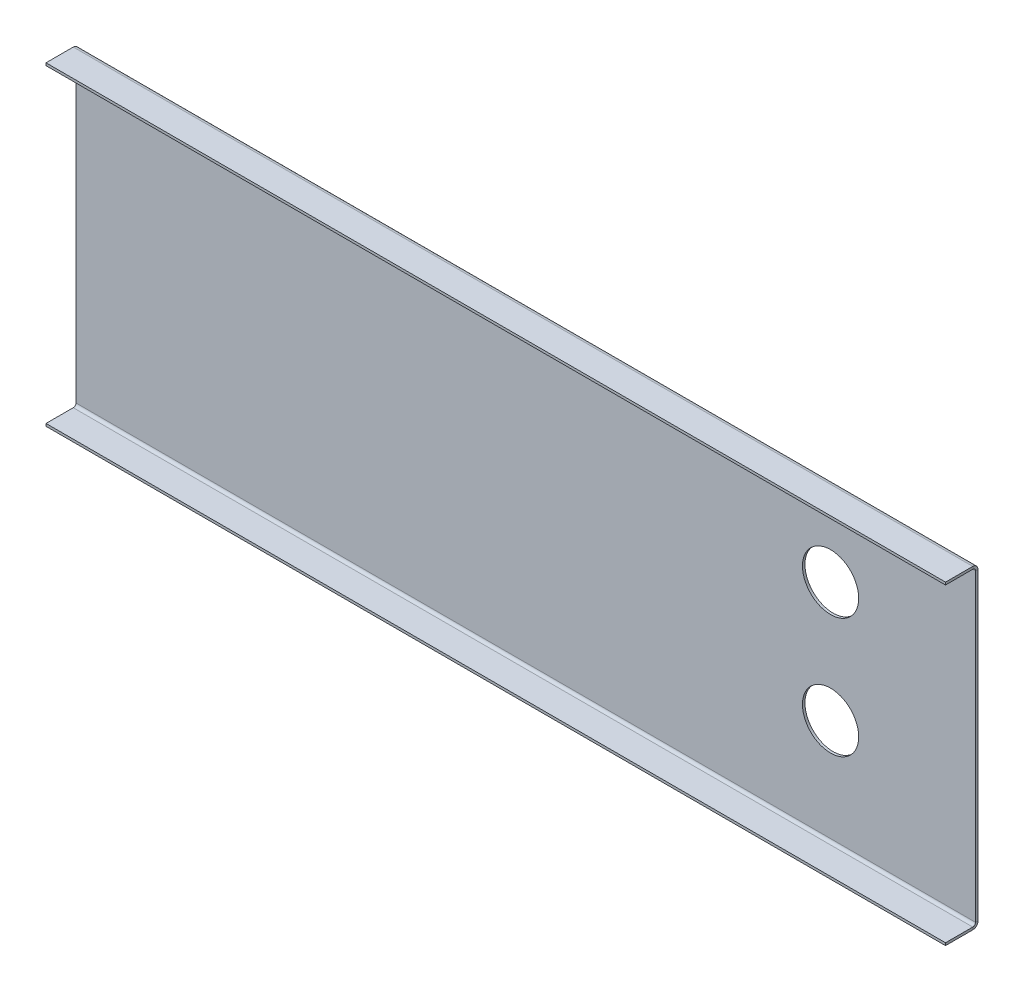
ISO-10303-21;
HEADER;
FILE_DESCRIPTION(('STEP AP214'),'2;1');
FILE_NAME('part.step','',(''),(''),'','','');
FILE_SCHEMA(('AUTOMOTIVE_DESIGN { 1 0 10303 214 1 1 1 1 }'));
ENDSEC;
DATA;
#1=APPLICATION_CONTEXT('core data for automotive mechanical design processes');
#2=APPLICATION_PROTOCOL_DEFINITION('international standard','automotive_design',2000,#1);
#3=PRODUCT_CONTEXT('',#1,'mechanical');
#4=PRODUCT('Part','Part','',(#3));
#5=PRODUCT_RELATED_PRODUCT_CATEGORY('part','',(#4));
#6=PRODUCT_DEFINITION_FORMATION('','',#4);
#7=PRODUCT_DEFINITION_CONTEXT('part definition',#1,'design');
#8=PRODUCT_DEFINITION('design','',#6,#7);
#9=PRODUCT_DEFINITION_SHAPE('','',#8);
#10=(LENGTH_UNIT() NAMED_UNIT(*) SI_UNIT(.MILLI.,.METRE.));
#11=(NAMED_UNIT(*) PLANE_ANGLE_UNIT() SI_UNIT($,.RADIAN.));
#12=(NAMED_UNIT(*) SI_UNIT($,.STERADIAN.) SOLID_ANGLE_UNIT());
#13=UNCERTAINTY_MEASURE_WITH_UNIT(LENGTH_MEASURE(1.E-05),#10,'distance_accuracy_value','');
#14=(GEOMETRIC_REPRESENTATION_CONTEXT(3) GLOBAL_UNCERTAINTY_ASSIGNED_CONTEXT((#13)) GLOBAL_UNIT_ASSIGNED_CONTEXT((#10,
#11,#12)) REPRESENTATION_CONTEXT('',''));
#15=CARTESIAN_POINT('',(0.,0.,0.));
#16=DIRECTION('',(0.,0.,1.));
#17=DIRECTION('',(1.,0.,0.));
#18=AXIS2_PLACEMENT_3D('',#15,#16,#17);
#19=CARTESIAN_POINT('',(0.,0.,-1.));
#20=DIRECTION('',(0.,0.,1.));
#21=DIRECTION('',(1.,0.,0.));
#22=AXIS2_PLACEMENT_3D('',#19,#20,#21);
#23=PLANE('',#22);
#24=CARTESIAN_POINT('',(244.300049420994,-56.452668213457,-1.));
#25=DIRECTION('',(0.,0.,-1.));
#26=DIRECTION('',(-1.,0.,0.));
#27=AXIS2_PLACEMENT_3D('',#24,#25,#26);
#28=CIRCLE('',#27,11.25);
#29=CARTESIAN_POINT('',(233.050049420994,-56.452668213457,-1.));
#30=VERTEX_POINT('',#29);
#31=EDGE_CURVE('E260',#30,#30,#28,.T.);
#32=ORIENTED_EDGE('',*,*,#31,.F.);
#33=EDGE_LOOP('',(#32));
#34=FACE_BOUND('',#33,.T.);
#35=CARTESIAN_POINT('',(244.300049420994,-8.45266821345704,-1.));
#36=DIRECTION('',(0.,0.,-1.));
#37=DIRECTION('',(-1.,0.,0.));
#38=AXIS2_PLACEMENT_3D('',#35,#36,#37);
#39=CIRCLE('',#38,11.25);
#40=CARTESIAN_POINT('',(233.050049420994,-8.45266821345704,-1.));
#41=VERTEX_POINT('',#40);
#42=EDGE_CURVE('E251',#41,#41,#39,.T.);
#43=ORIENTED_EDGE('',*,*,#42,.F.);
#44=EDGE_LOOP('',(#43));
#45=FACE_BOUND('',#44,.T.);
#46=DIRECTION('',(1.,0.,0.));
#47=VECTOR('',#46,1.);
#48=CARTESIAN_POINT('',(302.300049420994,-97.3526682134571,-1.));
#49=LINE('',#48,#47);
#50=CARTESIAN_POINT('',(302.300049420994,-97.3526682134571,-1.));
#51=VERTEX_POINT('',#50);
#52=CARTESIAN_POINT('',(-57.699950579006,-97.3526682134571,-1.));
#53=VERTEX_POINT('',#52);
#54=EDGE_CURVE('E133',#51,#53,#49,.F.);
#55=ORIENTED_EDGE('',*,*,#54,.T.);
#56=DIRECTION('',(0.,-1.,0.));
#57=VECTOR('',#56,1.);
#58=CARTESIAN_POINT('',(-57.699950579006,25.5473317865429,-1.));
#59=LINE('',#58,#57);
#60=CARTESIAN_POINT('',(-57.699950579006,24.4473317865429,-1.));
#61=VERTEX_POINT('',#60);
#62=EDGE_CURVE('E44',#61,#53,#59,.T.);
#63=ORIENTED_EDGE('',*,*,#62,.F.);
#64=DIRECTION('',(-1.,0.,0.));
#65=VECTOR('',#64,1.);
#66=CARTESIAN_POINT('',(-57.699950579006,24.4473317865429,-1.));
#67=LINE('',#66,#65);
#68=CARTESIAN_POINT('',(302.300049420994,24.4473317865429,-1.));
#69=VERTEX_POINT('',#68);
#70=EDGE_CURVE('E223',#61,#69,#67,.F.);
#71=ORIENTED_EDGE('',*,*,#70,.T.);
#72=DIRECTION('',(0.,1.,0.));
#73=VECTOR('',#72,1.);
#74=CARTESIAN_POINT('',(302.300049420994,25.5473317865429,-1.));
#75=LINE('',#74,#73);
#76=EDGE_CURVE('E11',#51,#69,#75,.T.);
#77=ORIENTED_EDGE('',*,*,#76,.F.);
#78=EDGE_LOOP('',(#55,#63,#71,#77));
#79=FACE_BOUND('',#78,.T.);
#80=ADVANCED_FACE('F35',(#34,#45,#79),#23,.F.);
#81=CARTESIAN_POINT('',(0.,0.,0.));
#82=DIRECTION('',(0.,0.,1.));
#83=DIRECTION('',(1.,0.,0.));
#84=AXIS2_PLACEMENT_3D('',#81,#82,#83);
#85=PLANE('',#84);
#86=CARTESIAN_POINT('',(244.300049420994,-56.452668213457,0.));
#87=DIRECTION('',(0.,0.,1.));
#88=DIRECTION('',(1.,0.,0.));
#89=AXIS2_PLACEMENT_3D('',#86,#87,#88);
#90=CIRCLE('',#89,11.25);
#91=CARTESIAN_POINT('',(255.550049420994,-56.452668213457,0.));
#92=VERTEX_POINT('',#91);
#93=EDGE_CURVE('E39',#92,#92,#90,.T.);
#94=ORIENTED_EDGE('',*,*,#93,.F.);
#95=EDGE_LOOP('',(#94));
#96=FACE_BOUND('',#95,.T.);
#97=CARTESIAN_POINT('',(244.300049420994,-8.45266821345704,0.));
#98=DIRECTION('',(0.,0.,1.));
#99=DIRECTION('',(1.,0.,0.));
#100=AXIS2_PLACEMENT_3D('',#97,#98,#99);
#101=CIRCLE('',#100,11.25);
#102=CARTESIAN_POINT('',(255.550049420994,-8.45266821345704,0.));
#103=VERTEX_POINT('',#102);
#104=EDGE_CURVE('E248',#103,#103,#101,.T.);
#105=ORIENTED_EDGE('',*,*,#104,.F.);
#106=EDGE_LOOP('',(#105));
#107=FACE_BOUND('',#106,.T.);
#108=DIRECTION('',(0.,-1.,0.));
#109=VECTOR('',#108,1.);
#110=CARTESIAN_POINT('',(-57.699950579006,25.5473317865429,0.));
#111=LINE('',#110,#109);
#112=CARTESIAN_POINT('',(-57.699950579006,24.4473317865429,0.));
#113=VERTEX_POINT('',#112);
#114=CARTESIAN_POINT('',(-57.699950579006,-97.3526682134571,0.));
#115=VERTEX_POINT('',#114);
#116=EDGE_CURVE('E241',#113,#115,#111,.T.);
#117=ORIENTED_EDGE('',*,*,#116,.T.);
#118=DIRECTION('',(1.,0.,0.));
#119=VECTOR('',#118,1.);
#120=CARTESIAN_POINT('',(302.300049420994,-97.3526682134571,0.));
#121=LINE('',#120,#119);
#122=CARTESIAN_POINT('',(302.300049420994,-97.3526682134571,0.));
#123=VERTEX_POINT('',#122);
#124=EDGE_CURVE('E184',#123,#115,#121,.F.);
#125=ORIENTED_EDGE('',*,*,#124,.F.);
#126=DIRECTION('',(0.,1.,0.));
#127=VECTOR('',#126,1.);
#128=CARTESIAN_POINT('',(302.300049420994,25.5473317865429,0.));
#129=LINE('',#128,#127);
#130=CARTESIAN_POINT('',(302.300049420994,24.4473317865429,0.));
#131=VERTEX_POINT('',#130);
#132=EDGE_CURVE('E245',#123,#131,#129,.T.);
#133=ORIENTED_EDGE('',*,*,#132,.T.);
#134=DIRECTION('',(-1.,0.,0.));
#135=VECTOR('',#134,1.);
#136=CARTESIAN_POINT('',(-57.699950579006,24.4473317865429,0.));
#137=LINE('',#136,#135);
#138=EDGE_CURVE('E52',#113,#131,#137,.F.);
#139=ORIENTED_EDGE('',*,*,#138,.F.);
#140=EDGE_LOOP('',(#117,#125,#133,#139));
#141=FACE_BOUND('',#140,.T.);
#142=ADVANCED_FACE('F289',(#96,#107,#141),#85,.T.);
#143=CARTESIAN_POINT('',(302.300049420994,25.5473317865429,-1.));
#144=DIRECTION('',(1.,0.,0.));
#145=DIRECTION('',(0.,0.,-1.));
#146=AXIS2_PLACEMENT_3D('',#143,#144,#145);
#147=PLANE('',#146);
#148=ORIENTED_EDGE('',*,*,#132,.F.);
#149=DIRECTION('',(0.,0.,-1.));
#150=VECTOR('',#149,1.);
#151=CARTESIAN_POINT('',(302.300049420994,-97.3526682134571,0.));
#152=LINE('',#151,#150);
#153=EDGE_CURVE('E180',#123,#51,#152,.T.);
#154=ORIENTED_EDGE('',*,*,#153,.T.);
#155=ORIENTED_EDGE('',*,*,#76,.T.);
#156=DIRECTION('',(0.,0.,-1.));
#157=VECTOR('',#156,1.);
#158=CARTESIAN_POINT('',(302.300049420994,24.4473317865429,0.));
#159=LINE('',#158,#157);
#160=EDGE_CURVE('E238',#131,#69,#159,.T.);
#161=ORIENTED_EDGE('',*,*,#160,.F.);
#162=EDGE_LOOP('',(#148,#154,#155,#161));
#163=FACE_BOUND('',#162,.T.);
#164=ADVANCED_FACE('F295',(#163),#147,.T.);
#165=CARTESIAN_POINT('',(-57.699950579006,25.5473317865429,-1.));
#166=DIRECTION('',(-1.,0.,0.));
#167=DIRECTION('',(0.,-1.,0.));
#168=AXIS2_PLACEMENT_3D('',#165,#166,#167);
#169=PLANE('',#168);
#170=DIRECTION('',(0.,0.,-1.));
#171=VECTOR('',#170,1.);
#172=CARTESIAN_POINT('',(-57.699950579006,-97.3526682134571,0.));
#173=LINE('',#172,#171);
#174=EDGE_CURVE('E188',#115,#53,#173,.T.);
#175=ORIENTED_EDGE('',*,*,#174,.F.);
#176=ORIENTED_EDGE('',*,*,#116,.F.);
#177=DIRECTION('',(0.,0.,-1.));
#178=VECTOR('',#177,1.);
#179=CARTESIAN_POINT('',(-57.699950579006,24.4473317865429,0.));
#180=LINE('',#179,#178);
#181=EDGE_CURVE('E229',#113,#61,#180,.T.);
#182=ORIENTED_EDGE('',*,*,#181,.T.);
#183=ORIENTED_EDGE('',*,*,#62,.T.);
#184=EDGE_LOOP('',(#175,#176,#182,#183));
#185=FACE_BOUND('',#184,.T.);
#186=ADVANCED_FACE('F37',(#185),#169,.T.);
#187=CARTESIAN_POINT('',(302.300049420994,24.4473317865429,1.1));
#188=DIRECTION('',(1.,0.,0.));
#189=DIRECTION('',(0.,0.,-1.));
#190=AXIS2_PLACEMENT_3D('',#187,#188,#189);
#191=PLANE('',#190);
#192=DIRECTION('',(0.,1.,0.));
#193=VECTOR('',#192,1.);
#194=CARTESIAN_POINT('',(302.300049420994,25.5473317865429,1.1));
#195=LINE('',#194,#193);
#196=CARTESIAN_POINT('',(302.300049420994,25.5473317865429,1.09999999999999));
#197=VERTEX_POINT('',#196);
#198=CARTESIAN_POINT('',(302.300049420994,26.5473317865429,1.09999999999999));
#199=VERTEX_POINT('',#198);
#200=EDGE_CURVE('E191',#197,#199,#195,.T.);
#201=ORIENTED_EDGE('',*,*,#200,.F.);
#202=CARTESIAN_POINT('',(302.300049420994,24.4473317865429,1.1));
#203=DIRECTION('',(-1.,0.,0.));
#204=DIRECTION('',(0.,0.,1.));
#205=AXIS2_PLACEMENT_3D('',#202,#203,#204);
#206=CIRCLE('',#205,1.1);
#207=EDGE_CURVE('E232',#131,#197,#206,.F.);
#208=ORIENTED_EDGE('',*,*,#207,.F.);
#209=ORIENTED_EDGE('',*,*,#160,.T.);
#210=CARTESIAN_POINT('',(302.300049420994,24.4473317865429,1.1));
#211=DIRECTION('',(-1.,0.,0.));
#212=DIRECTION('',(0.,0.,1.));
#213=AXIS2_PLACEMENT_3D('',#210,#211,#212);
#214=CIRCLE('',#213,2.1);
#215=EDGE_CURVE('E225',#69,#199,#214,.F.);
#216=ORIENTED_EDGE('',*,*,#215,.T.);
#217=EDGE_LOOP('',(#201,#208,#209,#216));
#218=FACE_BOUND('',#217,.T.);
#219=ADVANCED_FACE('F308',(#218),#191,.T.);
#220=CARTESIAN_POINT('',(-57.699950579006,24.4473317865429,1.1));
#221=DIRECTION('',(1.,0.,0.));
#222=DIRECTION('',(0.,0.,-1.));
#223=AXIS2_PLACEMENT_3D('',#220,#221,#222);
#224=PLANE('',#223);
#225=CARTESIAN_POINT('',(-57.699950579006,24.4473317865429,1.1));
#226=DIRECTION('',(-1.,0.,0.));
#227=DIRECTION('',(0.,0.,1.));
#228=AXIS2_PLACEMENT_3D('',#225,#226,#227);
#229=CIRCLE('',#228,1.1);
#230=CARTESIAN_POINT('',(-57.699950579006,25.5473317865429,1.09999999999999));
#231=VERTEX_POINT('',#230);
#232=EDGE_CURVE('E222',#231,#113,#229,.T.);
#233=ORIENTED_EDGE('',*,*,#232,.F.);
#234=DIRECTION('',(0.,1.,0.));
#235=VECTOR('',#234,1.);
#236=CARTESIAN_POINT('',(-57.699950579006,25.5473317865429,1.09999999999999));
#237=LINE('',#236,#235);
#238=CARTESIAN_POINT('',(-57.699950579006,26.5473317865429,1.09999999999999));
#239=VERTEX_POINT('',#238);
#240=EDGE_CURVE('E195',#231,#239,#237,.T.);
#241=ORIENTED_EDGE('',*,*,#240,.T.);
#242=CARTESIAN_POINT('',(-57.699950579006,24.4473317865429,1.1));
#243=DIRECTION('',(-1.,0.,0.));
#244=DIRECTION('',(0.,0.,1.));
#245=AXIS2_PLACEMENT_3D('',#242,#243,#244);
#246=CIRCLE('',#245,2.1);
#247=EDGE_CURVE('E226',#239,#61,#246,.T.);
#248=ORIENTED_EDGE('',*,*,#247,.T.);
#249=ORIENTED_EDGE('',*,*,#181,.F.);
#250=EDGE_LOOP('',(#233,#241,#248,#249));
#251=FACE_BOUND('',#250,.T.);
#252=ADVANCED_FACE('F301',(#251),#224,.F.);
#253=CARTESIAN_POINT('',(-57.699950579006,24.4473317865429,1.1));
#254=DIRECTION('',(-1.,0.,0.));
#255=DIRECTION('',(0.,1.,0.));
#256=AXIS2_PLACEMENT_3D('',#253,#254,#255);
#257=CYLINDRICAL_SURFACE('',#256,2.1);
#258=ORIENTED_EDGE('',*,*,#70,.F.);
#259=ORIENTED_EDGE('',*,*,#247,.F.);
#260=DIRECTION('',(1.,0.,0.));
#261=VECTOR('',#260,1.);
#262=CARTESIAN_POINT('',(0.,26.5473317865429,1.09999999999999));
#263=LINE('',#262,#261);
#264=EDGE_CURVE('E198',#239,#199,#263,.T.);
#265=ORIENTED_EDGE('',*,*,#264,.T.);
#266=ORIENTED_EDGE('',*,*,#215,.F.);
#267=EDGE_LOOP('',(#258,#259,#265,#266));
#268=FACE_BOUND('',#267,.T.);
#269=ADVANCED_FACE('F320',(#268),#257,.T.);
#270=CARTESIAN_POINT('',(-57.699950579006,24.4473317865429,1.1));
#271=DIRECTION('',(-1.,0.,0.));
#272=DIRECTION('',(0.,1.,0.));
#273=AXIS2_PLACEMENT_3D('',#270,#271,#272);
#274=CYLINDRICAL_SURFACE('',#273,1.1);
#275=ORIENTED_EDGE('',*,*,#138,.T.);
#276=ORIENTED_EDGE('',*,*,#207,.T.);
#277=DIRECTION('',(-1.,0.,0.));
#278=VECTOR('',#277,1.);
#279=CARTESIAN_POINT('',(302.300049420994,25.5473317865429,1.1));
#280=LINE('',#279,#278);
#281=EDGE_CURVE('E193',#197,#231,#280,.T.);
#282=ORIENTED_EDGE('',*,*,#281,.T.);
#283=ORIENTED_EDGE('',*,*,#232,.T.);
#284=EDGE_LOOP('',(#275,#276,#282,#283));
#285=FACE_BOUND('',#284,.T.);
#286=ADVANCED_FACE('F341',(#285),#274,.F.);
#287=CARTESIAN_POINT('',(-57.6999505790059,26.547331786543,12.));
#288=DIRECTION('',(1.,0.,0.));
#289=DIRECTION('',(0.,0.,-1.));
#290=AXIS2_PLACEMENT_3D('',#287,#288,#289);
#291=PLANE('',#290);
#292=ORIENTED_EDGE('',*,*,#240,.F.);
#293=DIRECTION('',(0.,0.,1.));
#294=VECTOR('',#293,1.);
#295=CARTESIAN_POINT('',(-57.6999505790059,25.547331786543,12.));
#296=LINE('',#295,#294);
#297=CARTESIAN_POINT('',(-57.6999505790059,25.547331786543,12.));
#298=VERTEX_POINT('',#297);
#299=EDGE_CURVE('E202',#231,#298,#296,.T.);
#300=ORIENTED_EDGE('',*,*,#299,.T.);
#301=DIRECTION('',(0.,-1.,0.));
#302=VECTOR('',#301,1.);
#303=CARTESIAN_POINT('',(-57.6999505790059,26.547331786543,12.));
#304=LINE('',#303,#302);
#305=CARTESIAN_POINT('',(-57.6999505790059,26.547331786543,12.));
#306=VERTEX_POINT('',#305);
#307=EDGE_CURVE('E219',#306,#298,#304,.T.);
#308=ORIENTED_EDGE('',*,*,#307,.F.);
#309=DIRECTION('',(0.,0.,1.));
#310=VECTOR('',#309,1.);
#311=CARTESIAN_POINT('',(-57.6999505790059,26.547331786543,12.));
#312=LINE('',#311,#310);
#313=EDGE_CURVE('E203',#239,#306,#312,.T.);
#314=ORIENTED_EDGE('',*,*,#313,.F.);
#315=EDGE_LOOP('',(#292,#300,#308,#314));
#316=FACE_BOUND('',#315,.T.);
#317=ADVANCED_FACE('F329',(#316),#291,.F.);
#318=CARTESIAN_POINT('',(302.300049420994,26.5473317865429,0.));
#319=DIRECTION('',(-1.,0.,0.));
#320=DIRECTION('',(0.,0.,1.));
#321=AXIS2_PLACEMENT_3D('',#318,#319,#320);
#322=PLANE('',#321);
#323=ORIENTED_EDGE('',*,*,#200,.T.);
#324=DIRECTION('',(0.,0.,-1.));
#325=VECTOR('',#324,1.);
#326=CARTESIAN_POINT('',(302.300049420994,26.5473317865429,0.));
#327=LINE('',#326,#325);
#328=CARTESIAN_POINT('',(302.300049420994,26.547331786543,12.));
#329=VERTEX_POINT('',#328);
#330=EDGE_CURVE('E208',#329,#199,#327,.T.);
#331=ORIENTED_EDGE('',*,*,#330,.F.);
#332=DIRECTION('',(0.,-1.,0.));
#333=VECTOR('',#332,1.);
#334=CARTESIAN_POINT('',(302.300049420994,26.547331786543,12.));
#335=LINE('',#334,#333);
#336=CARTESIAN_POINT('',(302.300049420994,25.547331786543,12.));
#337=VERTEX_POINT('',#336);
#338=EDGE_CURVE('E211',#329,#337,#335,.T.);
#339=ORIENTED_EDGE('',*,*,#338,.T.);
#340=DIRECTION('',(0.,0.,-1.));
#341=VECTOR('',#340,1.);
#342=CARTESIAN_POINT('',(302.300049420994,25.5473317865429,0.));
#343=LINE('',#342,#341);
#344=EDGE_CURVE('E206',#337,#197,#343,.T.);
#345=ORIENTED_EDGE('',*,*,#344,.T.);
#346=EDGE_LOOP('',(#323,#331,#339,#345));
#347=FACE_BOUND('',#346,.T.);
#348=ADVANCED_FACE('F338',(#347),#322,.F.);
#349=CARTESIAN_POINT('',(0.,26.5473317865429,0.));
#350=DIRECTION('',(0.,-1.,0.));
#351=DIRECTION('',(0.,0.,-1.));
#352=AXIS2_PLACEMENT_3D('',#349,#350,#351);
#353=PLANE('',#352);
#354=ORIENTED_EDGE('',*,*,#264,.F.);
#355=ORIENTED_EDGE('',*,*,#313,.T.);
#356=DIRECTION('',(1.,0.,0.));
#357=VECTOR('',#356,1.);
#358=CARTESIAN_POINT('',(302.300049420994,26.547331786543,12.));
#359=LINE('',#358,#357);
#360=EDGE_CURVE('E205',#306,#329,#359,.T.);
#361=ORIENTED_EDGE('',*,*,#360,.T.);
#362=ORIENTED_EDGE('',*,*,#330,.T.);
#363=EDGE_LOOP('',(#354,#355,#361,#362));
#364=FACE_BOUND('',#363,.T.);
#365=ADVANCED_FACE('F324',(#364),#353,.F.);
#366=CARTESIAN_POINT('',(0.,25.5473317865429,0.));
#367=DIRECTION('',(0.,-1.,0.));
#368=DIRECTION('',(0.,0.,-1.));
#369=AXIS2_PLACEMENT_3D('',#366,#367,#368);
#370=PLANE('',#369);
#371=ORIENTED_EDGE('',*,*,#299,.F.);
#372=ORIENTED_EDGE('',*,*,#281,.F.);
#373=ORIENTED_EDGE('',*,*,#344,.F.);
#374=DIRECTION('',(1.,0.,0.));
#375=VECTOR('',#374,1.);
#376=CARTESIAN_POINT('',(302.300049420994,25.547331786543,12.));
#377=LINE('',#376,#375);
#378=EDGE_CURVE('E213',#298,#337,#377,.T.);
#379=ORIENTED_EDGE('',*,*,#378,.F.);
#380=EDGE_LOOP('',(#371,#372,#373,#379));
#381=FACE_BOUND('',#380,.T.);
#382=ADVANCED_FACE('F344',(#381),#370,.T.);
#383=CARTESIAN_POINT('',(302.300049420994,26.547331786543,12.));
#384=DIRECTION('',(0.,0.,-1.));
#385=DIRECTION('',(0.,1.,0.));
#386=AXIS2_PLACEMENT_3D('',#383,#384,#385);
#387=PLANE('',#386);
#388=ORIENTED_EDGE('',*,*,#378,.T.);
#389=ORIENTED_EDGE('',*,*,#338,.F.);
#390=ORIENTED_EDGE('',*,*,#360,.F.);
#391=ORIENTED_EDGE('',*,*,#307,.T.);
#392=EDGE_LOOP('',(#388,#389,#390,#391));
#393=FACE_BOUND('',#392,.T.);
#394=ADVANCED_FACE('F335',(#393),#387,.F.);
#395=CARTESIAN_POINT('',(-57.699950579006,-97.3526682134571,1.09999999999999));
#396=DIRECTION('',(-1.,0.,0.));
#397=DIRECTION('',(0.,0.,1.));
#398=AXIS2_PLACEMENT_3D('',#395,#396,#397);
#399=PLANE('',#398);
#400=DIRECTION('',(0.,-1.,0.));
#401=VECTOR('',#400,1.);
#402=CARTESIAN_POINT('',(-57.6999505790059,-98.4526682134571,1.09999999999999));
#403=LINE('',#402,#401);
#404=CARTESIAN_POINT('',(-57.699950579006,-98.4526682134571,1.09999999999998));
#405=VERTEX_POINT('',#404);
#406=CARTESIAN_POINT('',(-57.699950579006,-99.4526682134571,1.09999999999998));
#407=VERTEX_POINT('',#406);
#408=EDGE_CURVE('E250',#405,#407,#403,.T.);
#409=ORIENTED_EDGE('',*,*,#408,.F.);
#410=CARTESIAN_POINT('',(-57.699950579006,-97.3526682134571,1.09999999999999));
#411=DIRECTION('',(1.,0.,0.));
#412=DIRECTION('',(0.,0.,-1.));
#413=AXIS2_PLACEMENT_3D('',#410,#411,#412);
#414=CIRCLE('',#413,1.09999999999999);
#415=EDGE_CURVE('E136',#115,#405,#414,.F.);
#416=ORIENTED_EDGE('',*,*,#415,.F.);
#417=ORIENTED_EDGE('',*,*,#174,.T.);
#418=CARTESIAN_POINT('',(-57.699950579006,-97.3526682134571,1.09999999999999));
#419=DIRECTION('',(1.,0.,0.));
#420=DIRECTION('',(0.,0.,-1.));
#421=AXIS2_PLACEMENT_3D('',#418,#419,#420);
#422=CIRCLE('',#421,2.09999999999999);
#423=EDGE_CURVE('E179',#53,#407,#422,.F.);
#424=ORIENTED_EDGE('',*,*,#423,.T.);
#425=EDGE_LOOP('',(#409,#416,#417,#424));
#426=FACE_BOUND('',#425,.T.);
#427=ADVANCED_FACE('F312',(#426),#399,.T.);
#428=CARTESIAN_POINT('',(302.300049420994,-97.3526682134571,1.09999999999999));
#429=DIRECTION('',(-1.,0.,0.));
#430=DIRECTION('',(0.,0.,1.));
#431=AXIS2_PLACEMENT_3D('',#428,#429,#430);
#432=PLANE('',#431);
#433=CARTESIAN_POINT('',(302.300049420994,-97.3526682134571,1.09999999999999));
#434=DIRECTION('',(1.,0.,0.));
#435=DIRECTION('',(0.,0.,-1.));
#436=AXIS2_PLACEMENT_3D('',#433,#434,#435);
#437=CIRCLE('',#436,1.09999999999999);
#438=CARTESIAN_POINT('',(302.300049420994,-98.4526682134571,1.09999999999998));
#439=VERTEX_POINT('',#438);
#440=EDGE_CURVE('E143',#439,#123,#437,.T.);
#441=ORIENTED_EDGE('',*,*,#440,.F.);
#442=DIRECTION('',(0.,-1.,0.));
#443=VECTOR('',#442,1.);
#444=CARTESIAN_POINT('',(302.300049420994,-98.4526682134571,1.09999999999998));
#445=LINE('',#444,#443);
#446=CARTESIAN_POINT('',(302.300049420994,-99.4526682134571,1.09999999999997));
#447=VERTEX_POINT('',#446);
#448=EDGE_CURVE('E140',#439,#447,#445,.T.);
#449=ORIENTED_EDGE('',*,*,#448,.T.);
#450=CARTESIAN_POINT('',(302.300049420994,-97.3526682134571,1.09999999999999));
#451=DIRECTION('',(1.,0.,0.));
#452=DIRECTION('',(0.,0.,-1.));
#453=AXIS2_PLACEMENT_3D('',#450,#451,#452);
#454=CIRCLE('',#453,2.09999999999999);
#455=EDGE_CURVE('E126',#447,#51,#454,.T.);
#456=ORIENTED_EDGE('',*,*,#455,.T.);
#457=ORIENTED_EDGE('',*,*,#153,.F.);
#458=EDGE_LOOP('',(#441,#449,#456,#457));
#459=FACE_BOUND('',#458,.T.);
#460=ADVANCED_FACE('F141',(#459),#432,.F.);
#461=CARTESIAN_POINT('',(302.300049420994,-97.3526682134571,1.09999999999999));
#462=DIRECTION('',(1.,0.,0.));
#463=DIRECTION('',(0.,-1.,0.));
#464=AXIS2_PLACEMENT_3D('',#461,#462,#463);
#465=CYLINDRICAL_SURFACE('',#464,2.09999999999999);
#466=ORIENTED_EDGE('',*,*,#54,.F.);
#467=ORIENTED_EDGE('',*,*,#455,.F.);
#468=DIRECTION('',(-1.,0.,0.));
#469=VECTOR('',#468,1.);
#470=CARTESIAN_POINT('',(0.,-99.4526682134571,1.09999999999998));
#471=LINE('',#470,#469);
#472=EDGE_CURVE('E131',#447,#407,#471,.T.);
#473=ORIENTED_EDGE('',*,*,#472,.T.);
#474=ORIENTED_EDGE('',*,*,#423,.F.);
#475=EDGE_LOOP('',(#466,#467,#473,#474));
#476=FACE_BOUND('',#475,.T.);
#477=ADVANCED_FACE('F128',(#476),#465,.T.);
#478=CARTESIAN_POINT('',(302.300049420994,-97.3526682134571,1.09999999999999));
#479=DIRECTION('',(1.,0.,0.));
#480=DIRECTION('',(0.,-1.,0.));
#481=AXIS2_PLACEMENT_3D('',#478,#479,#480);
#482=CYLINDRICAL_SURFACE('',#481,1.09999999999999);
#483=ORIENTED_EDGE('',*,*,#124,.T.);
#484=ORIENTED_EDGE('',*,*,#415,.T.);
#485=DIRECTION('',(1.,0.,0.));
#486=VECTOR('',#485,1.);
#487=CARTESIAN_POINT('',(-57.6999505790059,-98.4526682134571,1.09999999999999));
#488=LINE('',#487,#486);
#489=EDGE_CURVE('E147',#405,#439,#488,.T.);
#490=ORIENTED_EDGE('',*,*,#489,.T.);
#491=ORIENTED_EDGE('',*,*,#440,.T.);
#492=EDGE_LOOP('',(#483,#484,#490,#491));
#493=FACE_BOUND('',#492,.T.);
#494=ADVANCED_FACE('F265',(#493),#482,.F.);
#495=CARTESIAN_POINT('',(302.300049420994,-99.4526682134571,12.));
#496=DIRECTION('',(-1.,0.,0.));
#497=DIRECTION('',(0.,0.,1.));
#498=AXIS2_PLACEMENT_3D('',#495,#496,#497);
#499=PLANE('',#498);
#500=ORIENTED_EDGE('',*,*,#448,.F.);
#501=DIRECTION('',(0.,0.,1.));
#502=VECTOR('',#501,1.);
#503=CARTESIAN_POINT('',(302.300049420994,-98.4526682134571,12.));
#504=LINE('',#503,#502);
#505=CARTESIAN_POINT('',(302.300049420994,-98.4526682134571,12.));
#506=VERTEX_POINT('',#505);
#507=EDGE_CURVE('E156',#439,#506,#504,.T.);
#508=ORIENTED_EDGE('',*,*,#507,.T.);
#509=DIRECTION('',(0.,1.,0.));
#510=VECTOR('',#509,1.);
#511=CARTESIAN_POINT('',(302.300049420994,-99.4526682134571,12.));
#512=LINE('',#511,#510);
#513=CARTESIAN_POINT('',(302.300049420994,-99.4526682134571,12.));
#514=VERTEX_POINT('',#513);
#515=EDGE_CURVE('E160',#514,#506,#512,.T.);
#516=ORIENTED_EDGE('',*,*,#515,.F.);
#517=DIRECTION('',(0.,0.,1.));
#518=VECTOR('',#517,1.);
#519=CARTESIAN_POINT('',(302.300049420994,-99.4526682134571,12.));
#520=LINE('',#519,#518);
#521=EDGE_CURVE('E152',#447,#514,#520,.T.);
#522=ORIENTED_EDGE('',*,*,#521,.F.);
#523=EDGE_LOOP('',(#500,#508,#516,#522));
#524=FACE_BOUND('',#523,.T.);
#525=ADVANCED_FACE('F158',(#524),#499,.F.);
#526=CARTESIAN_POINT('',(-57.6999505790059,-99.4526682134571,0.));
#527=DIRECTION('',(1.,0.,0.));
#528=DIRECTION('',(0.,0.,-1.));
#529=AXIS2_PLACEMENT_3D('',#526,#527,#528);
#530=PLANE('',#529);
#531=ORIENTED_EDGE('',*,*,#408,.T.);
#532=DIRECTION('',(0.,0.,-1.));
#533=VECTOR('',#532,1.);
#534=CARTESIAN_POINT('',(-57.6999505790059,-99.4526682134571,0.));
#535=LINE('',#534,#533);
#536=CARTESIAN_POINT('',(-57.6999505790059,-99.4526682134571,12.));
#537=VERTEX_POINT('',#536);
#538=EDGE_CURVE('E155',#537,#407,#535,.T.);
#539=ORIENTED_EDGE('',*,*,#538,.F.);
#540=DIRECTION('',(0.,1.,0.));
#541=VECTOR('',#540,1.);
#542=CARTESIAN_POINT('',(-57.6999505790059,-99.4526682134571,12.));
#543=LINE('',#542,#541);
#544=CARTESIAN_POINT('',(-57.6999505790059,-98.4526682134571,12.));
#545=VERTEX_POINT('',#544);
#546=EDGE_CURVE('E172',#537,#545,#543,.T.);
#547=ORIENTED_EDGE('',*,*,#546,.T.);
#548=DIRECTION('',(0.,0.,-1.));
#549=VECTOR('',#548,1.);
#550=CARTESIAN_POINT('',(-57.6999505790059,-98.4526682134571,0.));
#551=LINE('',#550,#549);
#552=EDGE_CURVE('E163',#545,#405,#551,.T.);
#553=ORIENTED_EDGE('',*,*,#552,.T.);
#554=EDGE_LOOP('',(#531,#539,#547,#553));
#555=FACE_BOUND('',#554,.T.);
#556=ADVANCED_FACE('F272',(#555),#530,.F.);
#557=CARTESIAN_POINT('',(0.,-99.4526682134571,-3.45067793005989E-13));
#558=DIRECTION('',(0.,1.,0.));
#559=DIRECTION('',(0.,0.,1.));
#560=AXIS2_PLACEMENT_3D('',#557,#558,#559);
#561=PLANE('',#560);
#562=ORIENTED_EDGE('',*,*,#472,.F.);
#563=ORIENTED_EDGE('',*,*,#521,.T.);
#564=DIRECTION('',(-1.,0.,0.));
#565=VECTOR('',#564,1.);
#566=CARTESIAN_POINT('',(-57.6999505790059,-99.4526682134571,12.));
#567=LINE('',#566,#565);
#568=EDGE_CURVE('E162',#514,#537,#567,.T.);
#569=ORIENTED_EDGE('',*,*,#568,.T.);
#570=ORIENTED_EDGE('',*,*,#538,.T.);
#571=EDGE_LOOP('',(#562,#563,#569,#570));
#572=FACE_BOUND('',#571,.T.);
#573=ADVANCED_FACE('F151',(#572),#561,.F.);
#574=CARTESIAN_POINT('',(0.,-98.4526682134571,-3.41576309644879E-13));
#575=DIRECTION('',(0.,1.,0.));
#576=DIRECTION('',(0.,0.,1.));
#577=AXIS2_PLACEMENT_3D('',#574,#575,#576);
#578=PLANE('',#577);
#579=ORIENTED_EDGE('',*,*,#507,.F.);
#580=ORIENTED_EDGE('',*,*,#489,.F.);
#581=ORIENTED_EDGE('',*,*,#552,.F.);
#582=DIRECTION('',(-1.,0.,0.));
#583=VECTOR('',#582,1.);
#584=CARTESIAN_POINT('',(-57.6999505790059,-98.4526682134571,12.));
#585=LINE('',#584,#583);
#586=EDGE_CURVE('E167',#506,#545,#585,.T.);
#587=ORIENTED_EDGE('',*,*,#586,.F.);
#588=EDGE_LOOP('',(#579,#580,#581,#587));
#589=FACE_BOUND('',#588,.T.);
#590=ADVANCED_FACE('F269',(#589),#578,.T.);
#591=CARTESIAN_POINT('',(-57.6999505790059,-99.4526682134571,12.));
#592=DIRECTION('',(0.,0.,-1.));
#593=DIRECTION('',(0.,1.,0.));
#594=AXIS2_PLACEMENT_3D('',#591,#592,#593);
#595=PLANE('',#594);
#596=ORIENTED_EDGE('',*,*,#586,.T.);
#597=ORIENTED_EDGE('',*,*,#546,.F.);
#598=ORIENTED_EDGE('',*,*,#568,.F.);
#599=ORIENTED_EDGE('',*,*,#515,.T.);
#600=EDGE_LOOP('',(#596,#597,#598,#599));
#601=FACE_BOUND('',#600,.T.);
#602=ADVANCED_FACE('F275',(#601),#595,.F.);
#603=CARTESIAN_POINT('',(244.300049420994,-8.45266821345704,9.));
#604=DIRECTION('',(0.,0.,-1.));
#605=DIRECTION('',(-1.,0.,0.));
#606=AXIS2_PLACEMENT_3D('',#603,#604,#605);
#607=CYLINDRICAL_SURFACE('',#606,11.25);
#608=ORIENTED_EDGE('',*,*,#104,.T.);
#609=EDGE_LOOP('',(#608));
#610=FACE_BOUND('',#609,.T.);
#611=ORIENTED_EDGE('',*,*,#42,.T.);
#612=EDGE_LOOP('',(#611));
#613=FACE_BOUND('',#612,.T.);
#614=ADVANCED_FACE('F277',(#610,#613),#607,.F.);
#615=CARTESIAN_POINT('',(244.300049420994,-56.452668213457,9.));
#616=DIRECTION('',(0.,0.,-1.));
#617=DIRECTION('',(-1.,0.,0.));
#618=AXIS2_PLACEMENT_3D('',#615,#616,#617);
#619=CYLINDRICAL_SURFACE('',#618,11.25);
#620=ORIENTED_EDGE('',*,*,#93,.T.);
#621=EDGE_LOOP('',(#620));
#622=FACE_BOUND('',#621,.T.);
#623=ORIENTED_EDGE('',*,*,#31,.T.);
#624=EDGE_LOOP('',(#623));
#625=FACE_BOUND('',#624,.T.);
#626=ADVANCED_FACE('F283',(#622,#625),#619,.F.);
#627=CLOSED_SHELL('',(#80,#142,#164,#186,#219,#252,#269,#286,#317,#348,#365,#382,#394,#427,#460,
#477,#494,#525,#556,#573,#590,#602,#614,#626));
#628=MANIFOLD_SOLID_BREP('B2',#627);
#629=ADVANCED_BREP_SHAPE_REPRESENTATION('',(#18,#628),#14);
#630=SHAPE_DEFINITION_REPRESENTATION(#9,#629);
ENDSEC;
END-ISO-10303-21;
